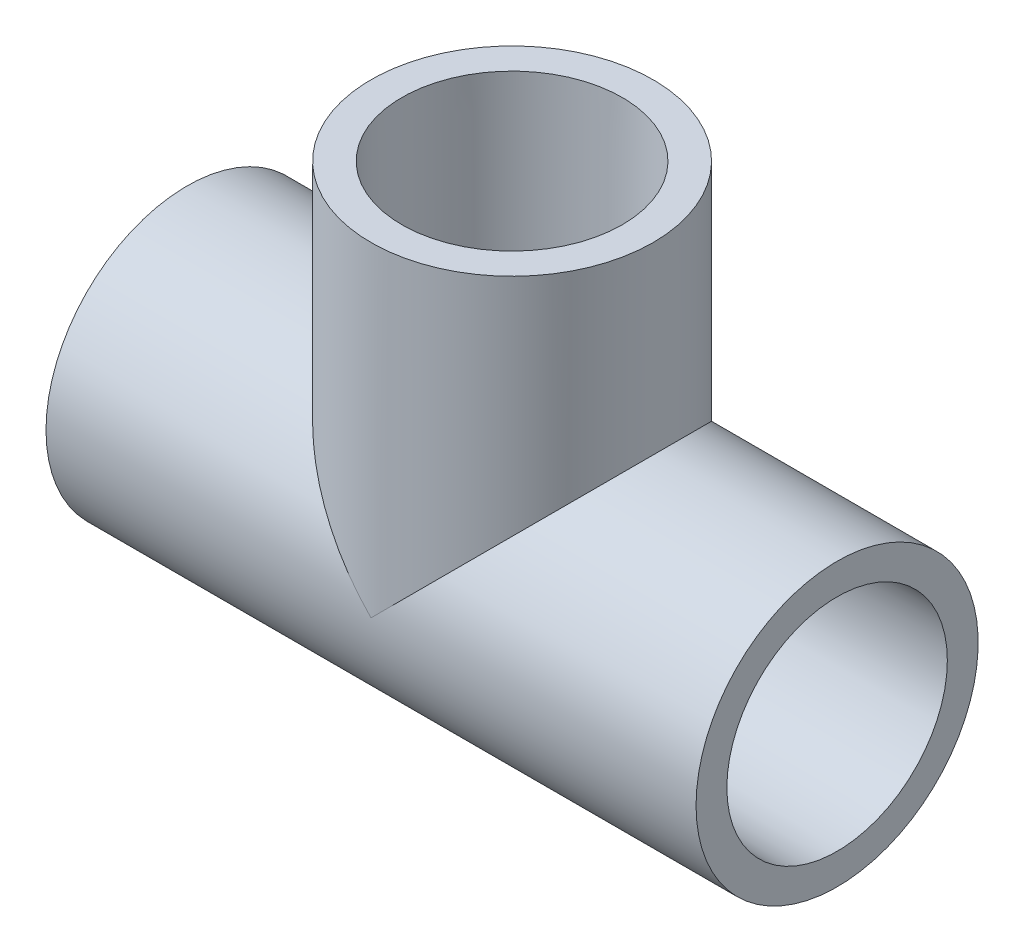
ISO-10303-21;
HEADER;
FILE_DESCRIPTION(('STEP AP214'),'2;1');
FILE_NAME('part.step','',(''),(''),'','','');
FILE_SCHEMA(('AUTOMOTIVE_DESIGN { 1 0 10303 214 1 1 1 1 }'));
ENDSEC;
DATA;
#1=APPLICATION_CONTEXT('core data for automotive mechanical design processes');
#2=APPLICATION_PROTOCOL_DEFINITION('international standard','automotive_design',2000,#1);
#3=PRODUCT_CONTEXT('',#1,'mechanical');
#4=PRODUCT('Part','Part','',(#3));
#5=PRODUCT_RELATED_PRODUCT_CATEGORY('part','',(#4));
#6=PRODUCT_DEFINITION_FORMATION('','',#4);
#7=PRODUCT_DEFINITION_CONTEXT('part definition',#1,'design');
#8=PRODUCT_DEFINITION('design','',#6,#7);
#9=PRODUCT_DEFINITION_SHAPE('','',#8);
#10=(LENGTH_UNIT() NAMED_UNIT(*) SI_UNIT(.MILLI.,.METRE.));
#11=(NAMED_UNIT(*) PLANE_ANGLE_UNIT() SI_UNIT($,.RADIAN.));
#12=(NAMED_UNIT(*) SI_UNIT($,.STERADIAN.) SOLID_ANGLE_UNIT());
#13=UNCERTAINTY_MEASURE_WITH_UNIT(LENGTH_MEASURE(1.E-05),#10,'distance_accuracy_value','');
#14=(GEOMETRIC_REPRESENTATION_CONTEXT(3) GLOBAL_UNCERTAINTY_ASSIGNED_CONTEXT((#13)) GLOBAL_UNIT_ASSIGNED_CONTEXT((#10,
#11,#12)) REPRESENTATION_CONTEXT('',''));
#15=CARTESIAN_POINT('',(0.,0.,0.));
#16=DIRECTION('',(0.,0.,1.));
#17=DIRECTION('',(1.,0.,0.));
#18=AXIS2_PLACEMENT_3D('',#15,#16,#17);
#19=CARTESIAN_POINT('',(-12.7,0.,0.));
#20=DIRECTION('',(1.,0.,0.));
#21=DIRECTION('',(0.,0.,-1.00000000000002));
#22=AXIS2_PLACEMENT_3D('',#19,#20,#21);
#23=PLANE('',#22);
#24=CARTESIAN_POINT('',(-12.7,0.,0.));
#25=DIRECTION('',(-1.,0.,0.));
#26=DIRECTION('',(0.,0.,1.00000000000002));
#27=AXIS2_PLACEMENT_3D('',#24,#25,#26);
#28=CIRCLE('',#27,10.6172);
#29=CARTESIAN_POINT('',(-12.7,0.,10.6172000000002));
#30=VERTEX_POINT('',#29);
#31=EDGE_CURVE('E90',#30,#30,#28,.T.);
#32=ORIENTED_EDGE('',*,*,#31,.T.);
#33=EDGE_LOOP('',(#32));
#34=FACE_BOUND('',#33,.T.);
#35=CARTESIAN_POINT('',(-12.7,0.,0.));
#36=DIRECTION('',(1.,0.,0.));
#37=DIRECTION('',(0.,0.,-1.00000000000002));
#38=AXIS2_PLACEMENT_3D('',#35,#36,#37);
#39=CIRCLE('',#38,7.8994);
#40=CARTESIAN_POINT('',(-12.7,0.,-7.89940000000017));
#41=VERTEX_POINT('',#40);
#42=EDGE_CURVE('E73',#41,#41,#39,.T.);
#43=ORIENTED_EDGE('',*,*,#42,.T.);
#44=EDGE_LOOP('',(#43));
#45=FACE_BOUND('',#44,.T.);
#46=ADVANCED_FACE('F34',(#34,#45),#23,.F.);
#47=CARTESIAN_POINT('',(12.7,0.,0.));
#48=DIRECTION('',(1.,0.,0.));
#49=DIRECTION('',(0.,0.,-1.00000000000002));
#50=AXIS2_PLACEMENT_3D('',#47,#48,#49);
#51=PLANE('',#50);
#52=CARTESIAN_POINT('',(12.7,0.,0.));
#53=DIRECTION('',(1.,0.,0.));
#54=DIRECTION('',(0.,0.,-1.00000000000002));
#55=AXIS2_PLACEMENT_3D('',#52,#53,#54);
#56=CIRCLE('',#55,7.8994);
#57=CARTESIAN_POINT('',(12.7,0.,-7.89940000000011));
#58=VERTEX_POINT('',#57);
#59=EDGE_CURVE('E70',#58,#58,#56,.T.);
#60=ORIENTED_EDGE('',*,*,#59,.F.);
#61=EDGE_LOOP('',(#60));
#62=FACE_BOUND('',#61,.T.);
#63=CARTESIAN_POINT('',(12.7,0.,0.));
#64=DIRECTION('',(1.,0.,0.));
#65=DIRECTION('',(0.,0.,-1.00000000000002));
#66=AXIS2_PLACEMENT_3D('',#63,#64,#65);
#67=CIRCLE('',#66,10.6172);
#68=CARTESIAN_POINT('',(12.7,0.,-10.6172000000002));
#69=VERTEX_POINT('',#68);
#70=EDGE_CURVE('E61',#69,#69,#67,.F.);
#71=ORIENTED_EDGE('',*,*,#70,.F.);
#72=EDGE_LOOP('',(#71));
#73=FACE_BOUND('',#72,.T.);
#74=ADVANCED_FACE('F112',(#62,#73),#51,.T.);
#75=CARTESIAN_POINT('',(12.7,0.,0.));
#76=DIRECTION('',(-1.,0.,0.));
#77=DIRECTION('',(0.,0.,1.00000000000002));
#78=AXIS2_PLACEMENT_3D('',#75,#76,#77);
#79=CYLINDRICAL_SURFACE('',#78,13.7795);
#80=CARTESIAN_POINT('',(-31.7500000000001,0.,0.));
#81=DIRECTION('',(-1.,0.,0.));
#82=DIRECTION('',(0.,0.,1.00000000000002));
#83=AXIS2_PLACEMENT_3D('',#80,#81,#82);
#84=CIRCLE('',#83,13.7795);
#85=CARTESIAN_POINT('',(-31.7500000000001,0.,13.7795000000002));
#86=VERTEX_POINT('',#85);
#87=EDGE_CURVE('E87',#86,#86,#84,.T.);
#88=ORIENTED_EDGE('',*,*,#87,.F.);
#89=EDGE_LOOP('',(#88));
#90=FACE_BOUND('',#89,.T.);
#91=CARTESIAN_POINT('',(31.75,0.,0.));
#92=DIRECTION('',(-1.,0.,0.));
#93=DIRECTION('',(0.,0.,1.00000000000002));
#94=AXIS2_PLACEMENT_3D('',#91,#92,#93);
#95=CIRCLE('',#94,13.7795);
#96=CARTESIAN_POINT('',(31.75,0.,13.7795000000003));
#97=VERTEX_POINT('',#96);
#98=EDGE_CURVE('E75',#97,#97,#95,.T.);
#99=ORIENTED_EDGE('',*,*,#98,.T.);
#100=EDGE_LOOP('',(#99));
#101=FACE_BOUND('',#100,.T.);
#102=CARTESIAN_POINT('',(0.,0.,0.));
#103=DIRECTION('',(-0.707106781186548,-0.707106781186556,0.));
#104=DIRECTION('',(0.707106781186548,-0.707106781186556,0.));
#105=AXIS2_PLACEMENT_3D('',#102,#103,#104);
#106=ELLIPSE('',#105,19.4871557827201,13.7795);
#107=CARTESIAN_POINT('',(0.,0.,13.7795));
#108=VERTEX_POINT('',#107);
#109=CARTESIAN_POINT('',(0.,0.,-13.7795));
#110=VERTEX_POINT('',#109);
#111=EDGE_CURVE('E96',#108,#110,#106,.T.);
#112=ORIENTED_EDGE('',*,*,#111,.T.);
#113=CARTESIAN_POINT('',(0.,0.,0.));
#114=DIRECTION('',(0.707106781186548,-0.707106781186556,0.));
#115=DIRECTION('',(-0.707106781186548,-0.707106781186556,0.));
#116=AXIS2_PLACEMENT_3D('',#113,#114,#115);
#117=ELLIPSE('',#116,19.4871557827201,13.7795);
#118=EDGE_CURVE('E53',#110,#108,#117,.T.);
#119=ORIENTED_EDGE('',*,*,#118,.T.);
#120=EDGE_LOOP('',(#112,#119));
#121=FACE_BOUND('',#120,.T.);
#122=ADVANCED_FACE('F114',(#90,#101,#121),#79,.T.);
#123=CARTESIAN_POINT('',(-12.7,0.,0.));
#124=DIRECTION('',(-1.,0.,0.));
#125=DIRECTION('',(0.,0.,1.00000000000002));
#126=AXIS2_PLACEMENT_3D('',#123,#124,#125);
#127=CONICAL_SURFACE('',#126,10.6172,0.00799982933988648);
#128=CARTESIAN_POINT('',(-31.7500000000001,0.,0.));
#129=DIRECTION('',(-1.,0.,0.));
#130=DIRECTION('',(0.,0.,1.00000000000002));
#131=AXIS2_PLACEMENT_3D('',#128,#129,#130);
#132=CIRCLE('',#131,10.7696);
#133=CARTESIAN_POINT('',(-31.7500000000001,0.,10.7696000000002));
#134=VERTEX_POINT('',#133);
#135=EDGE_CURVE('E93',#134,#134,#132,.T.);
#136=ORIENTED_EDGE('',*,*,#135,.T.);
#137=EDGE_LOOP('',(#136));
#138=FACE_BOUND('',#137,.T.);
#139=ORIENTED_EDGE('',*,*,#31,.F.);
#140=EDGE_LOOP('',(#139));
#141=FACE_BOUND('',#140,.T.);
#142=ADVANCED_FACE('F121',(#138,#141),#127,.F.);
#143=CARTESIAN_POINT('',(31.75,0.,0.));
#144=DIRECTION('',(1.,0.,0.));
#145=DIRECTION('',(0.,0.,-1.00000000000002));
#146=AXIS2_PLACEMENT_3D('',#143,#144,#145);
#147=CONICAL_SURFACE('',#146,10.7696,0.00799982933988629);
#148=CARTESIAN_POINT('',(31.75,0.,0.));
#149=DIRECTION('',(-1.,0.,0.));
#150=DIRECTION('',(0.,0.,1.00000000000002));
#151=AXIS2_PLACEMENT_3D('',#148,#149,#150);
#152=CIRCLE('',#151,10.7696);
#153=CARTESIAN_POINT('',(31.75,0.,10.7696000000002));
#154=VERTEX_POINT('',#153);
#155=EDGE_CURVE('E78',#154,#154,#152,.T.);
#156=ORIENTED_EDGE('',*,*,#155,.F.);
#157=EDGE_LOOP('',(#156));
#158=FACE_BOUND('',#157,.T.);
#159=ORIENTED_EDGE('',*,*,#70,.T.);
#160=EDGE_LOOP('',(#159));
#161=FACE_BOUND('',#160,.T.);
#162=ADVANCED_FACE('F110',(#158,#161),#147,.F.);
#163=CARTESIAN_POINT('',(0.,31.7500000000001,0.));
#164=DIRECTION('',(0.,1.00000000000002,0.));
#165=DIRECTION('',(-1.,0.,0.));
#166=AXIS2_PLACEMENT_3D('',#163,#164,#165);
#167=CONICAL_SURFACE('',#166,10.7696,0.00799982933988657);
#168=CARTESIAN_POINT('',(0.,31.7500000000001,0.));
#169=DIRECTION('',(0.,-1.00000000000002,0.));
#170=DIRECTION('',(1.,0.,0.));
#171=AXIS2_PLACEMENT_3D('',#168,#169,#170);
#172=CIRCLE('',#171,10.7696);
#173=CARTESIAN_POINT('',(10.7696,31.7500000000001,0.));
#174=VERTEX_POINT('',#173);
#175=EDGE_CURVE('E98',#174,#174,#172,.T.);
#176=ORIENTED_EDGE('',*,*,#175,.F.);
#177=EDGE_LOOP('',(#176));
#178=FACE_BOUND('',#177,.T.);
#179=CARTESIAN_POINT('',(2.77555756156289E-13,12.7,0.));
#180=DIRECTION('',(0.,-1.00000000000002,0.));
#181=DIRECTION('',(1.,0.,0.));
#182=AXIS2_PLACEMENT_3D('',#179,#180,#181);
#183=CIRCLE('',#182,10.6172);
#184=CARTESIAN_POINT('',(10.6172000000003,12.7,0.));
#185=VERTEX_POINT('',#184);
#186=EDGE_CURVE('E101',#185,#185,#183,.T.);
#187=ORIENTED_EDGE('',*,*,#186,.T.);
#188=EDGE_LOOP('',(#187));
#189=FACE_BOUND('',#188,.T.);
#190=ADVANCED_FACE('F130',(#178,#189),#167,.F.);
#191=CARTESIAN_POINT('',(13.7795,31.7499999999999,0.));
#192=DIRECTION('',(0.,1.00000000000002,0.));
#193=DIRECTION('',(-1.,0.,0.));
#194=AXIS2_PLACEMENT_3D('',#191,#192,#193);
#195=PLANE('',#194);
#196=ORIENTED_EDGE('',*,*,#175,.T.);
#197=EDGE_LOOP('',(#196));
#198=FACE_BOUND('',#197,.T.);
#199=CARTESIAN_POINT('',(0.,31.7500000000001,0.));
#200=DIRECTION('',(0.,-1.00000000000002,0.));
#201=DIRECTION('',(1.,0.,0.));
#202=AXIS2_PLACEMENT_3D('',#199,#200,#201);
#203=CIRCLE('',#202,13.7795);
#204=CARTESIAN_POINT('',(13.7795,31.7500000000001,0.));
#205=VERTEX_POINT('',#204);
#206=EDGE_CURVE('E104',#205,#205,#203,.T.);
#207=ORIENTED_EDGE('',*,*,#206,.F.);
#208=EDGE_LOOP('',(#207));
#209=FACE_BOUND('',#208,.T.);
#210=ADVANCED_FACE('F36',(#198,#209),#195,.T.);
#211=CARTESIAN_POINT('',(0.,0.,0.));
#212=DIRECTION('',(0.,-1.00000000000002,0.));
#213=DIRECTION('',(1.,0.,0.));
#214=AXIS2_PLACEMENT_3D('',#211,#212,#213);
#215=CYLINDRICAL_SURFACE('',#214,13.7795);
#216=ORIENTED_EDGE('',*,*,#118,.F.);
#217=ORIENTED_EDGE('',*,*,#111,.F.);
#218=EDGE_LOOP('',(#216,#217));
#219=FACE_BOUND('',#218,.T.);
#220=ORIENTED_EDGE('',*,*,#206,.T.);
#221=EDGE_LOOP('',(#220));
#222=FACE_BOUND('',#221,.T.);
#223=ADVANCED_FACE('F133',(#219,#222),#215,.T.);
#224=CARTESIAN_POINT('',(-31.75,-13.7795,0.));
#225=DIRECTION('',(-1.,0.,0.));
#226=DIRECTION('',(0.,0.,1.00000000000002));
#227=AXIS2_PLACEMENT_3D('',#224,#225,#226);
#228=PLANE('',#227);
#229=ORIENTED_EDGE('',*,*,#87,.T.);
#230=EDGE_LOOP('',(#229));
#231=FACE_BOUND('',#230,.T.);
#232=ORIENTED_EDGE('',*,*,#135,.F.);
#233=EDGE_LOOP('',(#232));
#234=FACE_BOUND('',#233,.T.);
#235=ADVANCED_FACE('F127',(#231,#234),#228,.T.);
#236=CARTESIAN_POINT('',(31.75,-13.7795000000002,0.));
#237=DIRECTION('',(1.,0.,0.));
#238=DIRECTION('',(0.,0.,-1.00000000000002));
#239=AXIS2_PLACEMENT_3D('',#236,#237,#238);
#240=PLANE('',#239);
#241=ORIENTED_EDGE('',*,*,#155,.T.);
#242=EDGE_LOOP('',(#241));
#243=FACE_BOUND('',#242,.T.);
#244=ORIENTED_EDGE('',*,*,#98,.F.);
#245=EDGE_LOOP('',(#244));
#246=FACE_BOUND('',#245,.T.);
#247=ADVANCED_FACE('F139',(#243,#246),#240,.T.);
#248=CARTESIAN_POINT('',(2.77555756156289E-13,12.7,0.));
#249=DIRECTION('',(0.,-1.00000000000002,0.));
#250=DIRECTION('',(1.,0.,0.));
#251=AXIS2_PLACEMENT_3D('',#248,#249,#250);
#252=PLANE('',#251);
#253=CARTESIAN_POINT('',(2.77555756156289E-13,12.7,0.));
#254=DIRECTION('',(0.,-1.00000000000002,0.));
#255=DIRECTION('',(1.,0.,0.));
#256=AXIS2_PLACEMENT_3D('',#253,#254,#255);
#257=CIRCLE('',#256,7.8994);
#258=CARTESIAN_POINT('',(7.89940000000029,12.7,0.));
#259=VERTEX_POINT('',#258);
#260=EDGE_CURVE('E80',#259,#259,#257,.T.);
#261=ORIENTED_EDGE('',*,*,#260,.T.);
#262=EDGE_LOOP('',(#261));
#263=FACE_BOUND('',#262,.T.);
#264=ORIENTED_EDGE('',*,*,#186,.F.);
#265=EDGE_LOOP('',(#264));
#266=FACE_BOUND('',#265,.T.);
#267=ADVANCED_FACE('F65',(#263,#266),#252,.F.);
#268=CARTESIAN_POINT('',(31.75,0.,0.));
#269=DIRECTION('',(1.,0.,0.));
#270=DIRECTION('',(0.,0.,-1.00000000000002));
#271=AXIS2_PLACEMENT_3D('',#268,#269,#270);
#272=CYLINDRICAL_SURFACE('',#271,7.8994);
#273=CARTESIAN_POINT('',(0.,0.,0.));
#274=DIRECTION('',(0.707106781186548,-0.707106781186556,0.));
#275=DIRECTION('',(0.707106781186548,0.707106781186556,0.));
#276=AXIS2_PLACEMENT_3D('',#273,#274,#275);
#277=ELLIPSE('',#276,11.17143861461,7.8994);
#278=CARTESIAN_POINT('',(0.,0.,-7.8994));
#279=VERTEX_POINT('',#278);
#280=CARTESIAN_POINT('',(0.,0.,7.8994));
#281=VERTEX_POINT('',#280);
#282=EDGE_CURVE('E11',#279,#281,#277,.T.);
#283=ORIENTED_EDGE('',*,*,#282,.F.);
#284=CARTESIAN_POINT('',(0.,0.,0.));
#285=DIRECTION('',(0.707106781186548,0.707106781186556,0.));
#286=DIRECTION('',(0.707106781186548,-0.707106781186556,0.));
#287=AXIS2_PLACEMENT_3D('',#284,#285,#286);
#288=ELLIPSE('',#287,11.17143861461,7.8994);
#289=EDGE_CURVE('E42',#281,#279,#288,.F.);
#290=ORIENTED_EDGE('',*,*,#289,.F.);
#291=EDGE_LOOP('',(#283,#290));
#292=FACE_BOUND('',#291,.T.);
#293=ORIENTED_EDGE('',*,*,#59,.T.);
#294=EDGE_LOOP('',(#293));
#295=FACE_BOUND('',#294,.T.);
#296=ORIENTED_EDGE('',*,*,#42,.F.);
#297=EDGE_LOOP('',(#296));
#298=FACE_BOUND('',#297,.T.);
#299=ADVANCED_FACE('F62',(#292,#295,#298),#272,.F.);
#300=CARTESIAN_POINT('',(0.,0.,0.));
#301=DIRECTION('',(0.,-1.00000000000002,0.));
#302=DIRECTION('',(1.,0.,0.));
#303=AXIS2_PLACEMENT_3D('',#300,#301,#302);
#304=CYLINDRICAL_SURFACE('',#303,7.8994);
#305=ORIENTED_EDGE('',*,*,#282,.T.);
#306=ORIENTED_EDGE('',*,*,#289,.T.);
#307=EDGE_LOOP('',(#305,#306));
#308=FACE_BOUND('',#307,.T.);
#309=ORIENTED_EDGE('',*,*,#260,.F.);
#310=EDGE_LOOP('',(#309));
#311=FACE_BOUND('',#310,.T.);
#312=ADVANCED_FACE('F58',(#308,#311),#304,.F.);
#313=CLOSED_SHELL('',(#46,#74,#122,#142,#162,#190,#210,#223,#235,#247,#267,#299,#312));
#314=MANIFOLD_SOLID_BREP('B2',#313);
#315=ADVANCED_BREP_SHAPE_REPRESENTATION('',(#18,#314),#14);
#316=SHAPE_DEFINITION_REPRESENTATION(#9,#315);
ENDSEC;
END-ISO-10303-21;
